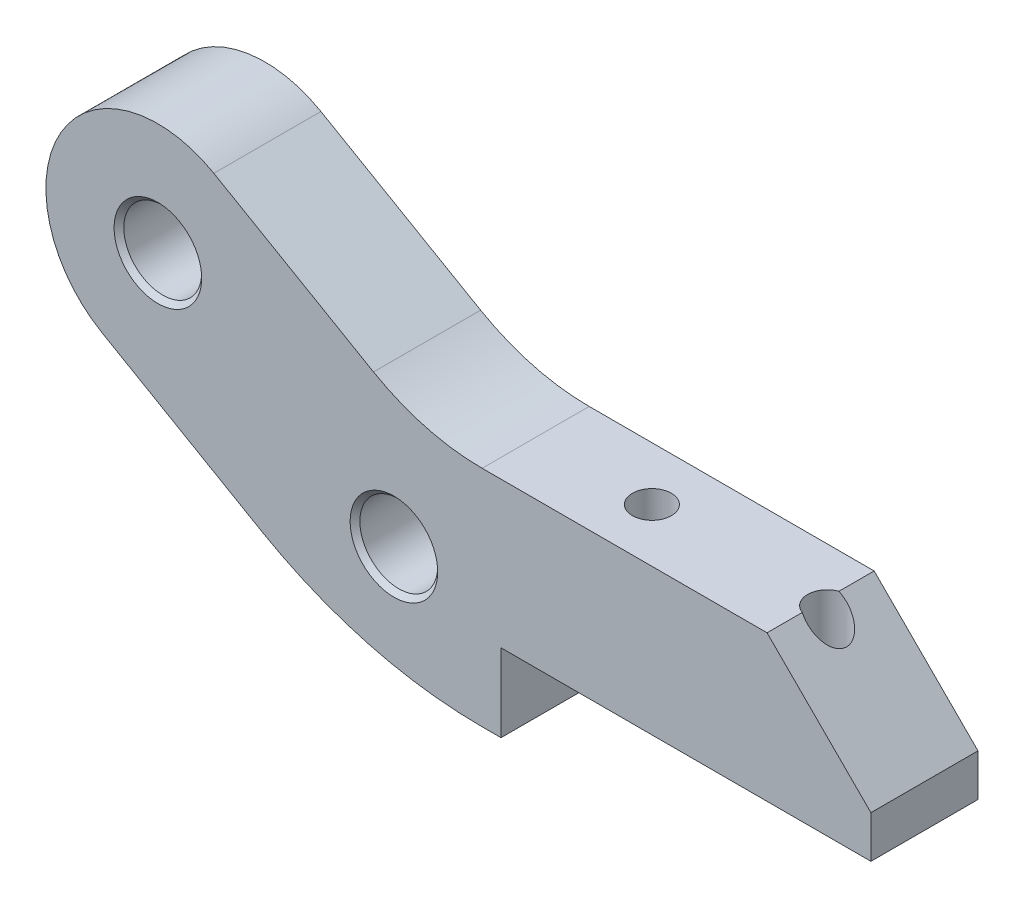
ISO-10303-21;
HEADER;
FILE_DESCRIPTION(('STEP AP214'),'2;1');
FILE_NAME('part.step','',(''),(''),'','','');
FILE_SCHEMA(('AUTOMOTIVE_DESIGN { 1 0 10303 214 1 1 1 1 }'));
ENDSEC;
DATA;
#1=APPLICATION_CONTEXT('core data for automotive mechanical design processes');
#2=APPLICATION_PROTOCOL_DEFINITION('international standard','automotive_design',2000,#1);
#3=PRODUCT_CONTEXT('',#1,'mechanical');
#4=PRODUCT('Part','Part','',(#3));
#5=PRODUCT_RELATED_PRODUCT_CATEGORY('part','',(#4));
#6=PRODUCT_DEFINITION_FORMATION('','',#4);
#7=PRODUCT_DEFINITION_CONTEXT('part definition',#1,'design');
#8=PRODUCT_DEFINITION('design','',#6,#7);
#9=PRODUCT_DEFINITION_SHAPE('','',#8);
#10=(LENGTH_UNIT() NAMED_UNIT(*) SI_UNIT(.MILLI.,.METRE.));
#11=(NAMED_UNIT(*) PLANE_ANGLE_UNIT() SI_UNIT($,.RADIAN.));
#12=(NAMED_UNIT(*) SI_UNIT($,.STERADIAN.) SOLID_ANGLE_UNIT());
#13=UNCERTAINTY_MEASURE_WITH_UNIT(LENGTH_MEASURE(1.E-05),#10,'distance_accuracy_value','');
#14=(GEOMETRIC_REPRESENTATION_CONTEXT(3) GLOBAL_UNCERTAINTY_ASSIGNED_CONTEXT((#13)) GLOBAL_UNIT_ASSIGNED_CONTEXT((#10,
#11,#12)) REPRESENTATION_CONTEXT('',''));
#15=CARTESIAN_POINT('',(0.,0.,0.));
#16=DIRECTION('',(0.,0.,1.));
#17=DIRECTION('',(1.,0.,0.));
#18=AXIS2_PLACEMENT_3D('',#15,#16,#17);
#19=CARTESIAN_POINT('',(23.0592502315386,53.8095821425827,11.));
#20=DIRECTION('',(0.,0.,-1.));
#21=DIRECTION('',(-1.,0.,0.));
#22=AXIS2_PLACEMENT_3D('',#19,#20,#21);
#23=CYLINDRICAL_SURFACE('',#22,22.3095821425826);
#24=CARTESIAN_POINT('',(23.0592502315386,53.8095821425827,0.));
#25=DIRECTION('',(0.,0.,-1.));
#26=DIRECTION('',(-1.,0.,0.));
#27=AXIS2_PLACEMENT_3D('',#24,#25,#26);
#28=CIRCLE('',#27,22.3095821425826);
#29=CARTESIAN_POINT('',(23.0592502315384,31.5000000000002,0.));
#30=VERTEX_POINT('',#29);
#31=CARTESIAN_POINT('',(11.9044591602472,34.4889172592905,0.));
#32=VERTEX_POINT('',#31);
#33=EDGE_CURVE('E189',#30,#32,#28,.T.);
#34=ORIENTED_EDGE('',*,*,#33,.T.);
#35=DIRECTION('',(0.,0.,-1.));
#36=VECTOR('',#35,1.);
#37=CARTESIAN_POINT('',(11.9044591602472,34.4889172592905,11.));
#38=LINE('',#37,#36);
#39=CARTESIAN_POINT('',(11.9044591602472,34.4889172592905,11.));
#40=VERTEX_POINT('',#39);
#41=EDGE_CURVE('E162',#40,#32,#38,.T.);
#42=ORIENTED_EDGE('',*,*,#41,.F.);
#43=CARTESIAN_POINT('',(23.0592502315386,53.8095821425827,11.));
#44=DIRECTION('',(0.,0.,-1.));
#45=DIRECTION('',(-1.,0.,0.));
#46=AXIS2_PLACEMENT_3D('',#43,#44,#45);
#47=CIRCLE('',#46,22.3095821425826);
#48=CARTESIAN_POINT('',(23.0592502315384,31.5000000000002,11.));
#49=VERTEX_POINT('',#48);
#50=EDGE_CURVE('E221',#49,#40,#47,.T.);
#51=ORIENTED_EDGE('',*,*,#50,.F.);
#52=DIRECTION('',(0.,0.,-1.));
#53=VECTOR('',#52,1.);
#54=CARTESIAN_POINT('',(23.0592502315384,31.5000000000002,11.));
#55=LINE('',#54,#53);
#56=EDGE_CURVE('E52',#49,#30,#55,.T.);
#57=ORIENTED_EDGE('',*,*,#56,.T.);
#58=EDGE_LOOP('',(#34,#42,#51,#57));
#59=FACE_BOUND('',#58,.T.);
#60=ADVANCED_FACE('F32',(#59),#23,.F.);
#61=CARTESIAN_POINT('',(11.9044591602472,34.4889172592905,11.));
#62=DIRECTION('',(-0.499999999999995,-0.866025403784442,0.));
#63=DIRECTION('',(0.866025403784442,-0.499999999999995,0.));
#64=AXIS2_PLACEMENT_3D('',#61,#62,#63);
#65=PLANE('',#64);
#66=DIRECTION('',(-0.866025403784442,0.499999999999995,0.));
#67=VECTOR('',#66,1.);
#68=CARTESIAN_POINT('',(11.9044591602472,34.4889172592905,0.));
#69=LINE('',#68,#67);
#70=CARTESIAN_POINT('',(-4.49871130596442,43.9592921435209,0.));
#71=VERTEX_POINT('',#70);
#72=EDGE_CURVE('E193',#32,#71,#69,.T.);
#73=ORIENTED_EDGE('',*,*,#72,.T.);
#74=DIRECTION('',(0.,0.,-1.));
#75=VECTOR('',#74,1.);
#76=CARTESIAN_POINT('',(-4.49871130596442,43.9592921435209,11.));
#77=LINE('',#76,#75);
#78=CARTESIAN_POINT('',(-4.49871130596442,43.9592921435209,11.));
#79=VERTEX_POINT('',#78);
#80=EDGE_CURVE('E159',#79,#71,#77,.T.);
#81=ORIENTED_EDGE('',*,*,#80,.F.);
#82=DIRECTION('',(-0.866025403784442,0.499999999999995,0.));
#83=VECTOR('',#82,1.);
#84=CARTESIAN_POINT('',(11.9044591602472,34.4889172592905,11.));
#85=LINE('',#84,#83);
#86=EDGE_CURVE('E224',#40,#79,#85,.T.);
#87=ORIENTED_EDGE('',*,*,#86,.F.);
#88=ORIENTED_EDGE('',*,*,#41,.T.);
#89=EDGE_LOOP('',(#73,#81,#87,#88));
#90=FACE_BOUND('',#89,.T.);
#91=ADVANCED_FACE('F284',(#90),#65,.F.);
#92=CARTESIAN_POINT('',(-10.2487113059646,34.,11.));
#93=DIRECTION('',(0.,0.,-1.));
#94=DIRECTION('',(-1.,0.,0.));
#95=AXIS2_PLACEMENT_3D('',#92,#93,#94);
#96=CYLINDRICAL_SURFACE('',#95,11.5);
#97=CARTESIAN_POINT('',(-10.2487113059646,34.,0.));
#98=DIRECTION('',(0.,0.,1.));
#99=DIRECTION('',(1.,0.,0.));
#100=AXIS2_PLACEMENT_3D('',#97,#98,#99);
#101=CIRCLE('',#100,11.5);
#102=CARTESIAN_POINT('',(-15.9987113059643,24.0407078564788,0.));
#103=VERTEX_POINT('',#102);
#104=EDGE_CURVE('E202',#71,#103,#101,.T.);
#105=ORIENTED_EDGE('',*,*,#104,.T.);
#106=DIRECTION('',(0.,0.,-1.));
#107=VECTOR('',#106,1.);
#108=CARTESIAN_POINT('',(-15.9987113059643,24.0407078564788,11.));
#109=LINE('',#108,#107);
#110=CARTESIAN_POINT('',(-15.9987113059643,24.0407078564788,11.));
#111=VERTEX_POINT('',#110);
#112=EDGE_CURVE('E156',#111,#103,#109,.T.);
#113=ORIENTED_EDGE('',*,*,#112,.F.);
#114=CARTESIAN_POINT('',(-10.2487113059646,34.,11.));
#115=DIRECTION('',(0.,0.,1.));
#116=DIRECTION('',(1.,0.,0.));
#117=AXIS2_PLACEMENT_3D('',#114,#115,#116);
#118=CIRCLE('',#117,11.5);
#119=EDGE_CURVE('E226',#79,#111,#118,.T.);
#120=ORIENTED_EDGE('',*,*,#119,.F.);
#121=ORIENTED_EDGE('',*,*,#80,.T.);
#122=EDGE_LOOP('',(#105,#113,#120,#121));
#123=FACE_BOUND('',#122,.T.);
#124=ADVANCED_FACE('F280',(#123),#96,.T.);
#125=CARTESIAN_POINT('',(-15.9987113059643,24.0407078564788,11.));
#126=DIRECTION('',(0.499999999999995,0.866025403784442,0.));
#127=DIRECTION('',(-0.866025403784442,0.499999999999995,0.));
#128=AXIS2_PLACEMENT_3D('',#125,#126,#127);
#129=PLANE('',#128);
#130=DIRECTION('',(0.866025403784442,-0.499999999999995,0.));
#131=VECTOR('',#130,1.);
#132=CARTESIAN_POINT('',(-15.9987113059643,24.0407078564788,0.));
#133=LINE('',#132,#131);
#134=CARTESIAN_POINT('',(0.404459160247318,14.5703329722484,0.));
#135=VERTEX_POINT('',#134);
#136=EDGE_CURVE('E204',#103,#135,#133,.T.);
#137=ORIENTED_EDGE('',*,*,#136,.T.);
#138=DIRECTION('',(0.,0.,-1.));
#139=VECTOR('',#138,1.);
#140=CARTESIAN_POINT('',(0.404459160247318,14.5703329722484,11.));
#141=LINE('',#140,#139);
#142=CARTESIAN_POINT('',(0.404459160247318,14.5703329722484,11.));
#143=VERTEX_POINT('',#142);
#144=EDGE_CURVE('E153',#143,#135,#141,.T.);
#145=ORIENTED_EDGE('',*,*,#144,.F.);
#146=DIRECTION('',(0.866025403784442,-0.499999999999995,0.));
#147=VECTOR('',#146,1.);
#148=CARTESIAN_POINT('',(-15.9987113059643,24.0407078564788,11.));
#149=LINE('',#148,#147);
#150=EDGE_CURVE('E228',#111,#143,#149,.T.);
#151=ORIENTED_EDGE('',*,*,#150,.F.);
#152=ORIENTED_EDGE('',*,*,#112,.T.);
#153=EDGE_LOOP('',(#137,#145,#151,#152));
#154=FACE_BOUND('',#153,.T.);
#155=ADVANCED_FACE('F277',(#154),#129,.F.);
#156=CARTESIAN_POINT('',(23.0592502315386,53.8095821425827,11.));
#157=DIRECTION('',(0.,0.,-1.));
#158=DIRECTION('',(-1.,0.,0.));
#159=AXIS2_PLACEMENT_3D('',#156,#157,#158);
#160=CYLINDRICAL_SURFACE('',#159,45.3095821425826);
#161=CARTESIAN_POINT('',(23.0592502315386,53.8095821425827,0.));
#162=DIRECTION('',(0.,0.,1.));
#163=DIRECTION('',(1.,0.,0.));
#164=AXIS2_PLACEMENT_3D('',#161,#162,#163);
#165=CIRCLE('',#164,45.3095821425826);
#166=CARTESIAN_POINT('',(23.0592502315384,8.50000000000015,0.));
#167=VERTEX_POINT('',#166);
#168=EDGE_CURVE('E206',#135,#167,#165,.T.);
#169=ORIENTED_EDGE('',*,*,#168,.T.);
#170=DIRECTION('',(0.,0.,-1.));
#171=VECTOR('',#170,1.);
#172=CARTESIAN_POINT('',(23.0592502315384,8.50000000000015,11.));
#173=LINE('',#172,#171);
#174=CARTESIAN_POINT('',(23.0592502315384,8.50000000000015,11.));
#175=VERTEX_POINT('',#174);
#176=EDGE_CURVE('E150',#175,#167,#173,.T.);
#177=ORIENTED_EDGE('',*,*,#176,.F.);
#178=CARTESIAN_POINT('',(23.0592502315386,53.8095821425827,11.));
#179=DIRECTION('',(0.,0.,1.));
#180=DIRECTION('',(1.,0.,0.));
#181=AXIS2_PLACEMENT_3D('',#178,#179,#180);
#182=CIRCLE('',#181,45.3095821425826);
#183=EDGE_CURVE('E230',#143,#175,#182,.T.);
#184=ORIENTED_EDGE('',*,*,#183,.F.);
#185=ORIENTED_EDGE('',*,*,#144,.T.);
#186=EDGE_LOOP('',(#169,#177,#184,#185));
#187=FACE_BOUND('',#186,.T.);
#188=ADVANCED_FACE('F273',(#187),#160,.T.);
#189=CARTESIAN_POINT('',(23.0592502315384,8.50000000000015,11.));
#190=DIRECTION('',(0.,1.,0.));
#191=DIRECTION('',(-1.,0.,0.));
#192=AXIS2_PLACEMENT_3D('',#189,#190,#191);
#193=PLANE('',#192);
#194=DIRECTION('',(1.,0.,0.));
#195=VECTOR('',#194,1.);
#196=CARTESIAN_POINT('',(23.0592502315384,8.50000000000015,0.));
#197=LINE('',#196,#195);
#198=CARTESIAN_POINT('',(25.,8.5,0.));
#199=VERTEX_POINT('',#198);
#200=EDGE_CURVE('E208',#167,#199,#197,.T.);
#201=ORIENTED_EDGE('',*,*,#200,.T.);
#202=DIRECTION('',(0.,0.,-1.));
#203=VECTOR('',#202,1.);
#204=CARTESIAN_POINT('',(25.,8.5,11.));
#205=LINE('',#204,#203);
#206=CARTESIAN_POINT('',(25.,8.5,11.));
#207=VERTEX_POINT('',#206);
#208=EDGE_CURVE('E147',#207,#199,#205,.T.);
#209=ORIENTED_EDGE('',*,*,#208,.F.);
#210=DIRECTION('',(1.,0.,0.));
#211=VECTOR('',#210,1.);
#212=CARTESIAN_POINT('',(23.0592502315384,8.50000000000015,11.));
#213=LINE('',#212,#211);
#214=EDGE_CURVE('E232',#175,#207,#213,.T.);
#215=ORIENTED_EDGE('',*,*,#214,.F.);
#216=ORIENTED_EDGE('',*,*,#176,.T.);
#217=EDGE_LOOP('',(#201,#209,#215,#216));
#218=FACE_BOUND('',#217,.T.);
#219=ADVANCED_FACE('F268',(#218),#193,.F.);
#220=CARTESIAN_POINT('',(25.,8.5,11.));
#221=DIRECTION('',(-1.,0.,0.));
#222=DIRECTION('',(0.,0.,1.));
#223=AXIS2_PLACEMENT_3D('',#220,#221,#222);
#224=PLANE('',#223);
#225=DIRECTION('',(0.,1.,0.));
#226=VECTOR('',#225,1.);
#227=CARTESIAN_POINT('',(25.,8.5,0.));
#228=LINE('',#227,#226);
#229=CARTESIAN_POINT('',(25.,16.5,0.));
#230=VERTEX_POINT('',#229);
#231=EDGE_CURVE('E210',#199,#230,#228,.T.);
#232=ORIENTED_EDGE('',*,*,#231,.T.);
#233=DIRECTION('',(0.,0.,-1.));
#234=VECTOR('',#233,1.);
#235=CARTESIAN_POINT('',(25.,16.5,11.));
#236=LINE('',#235,#234);
#237=CARTESIAN_POINT('',(25.,16.5,11.));
#238=VERTEX_POINT('',#237);
#239=EDGE_CURVE('E144',#238,#230,#236,.T.);
#240=ORIENTED_EDGE('',*,*,#239,.F.);
#241=DIRECTION('',(0.,1.,0.));
#242=VECTOR('',#241,1.);
#243=CARTESIAN_POINT('',(25.,8.5,11.));
#244=LINE('',#243,#242);
#245=EDGE_CURVE('E234',#207,#238,#244,.T.);
#246=ORIENTED_EDGE('',*,*,#245,.F.);
#247=ORIENTED_EDGE('',*,*,#208,.T.);
#248=EDGE_LOOP('',(#232,#240,#246,#247));
#249=FACE_BOUND('',#248,.T.);
#250=ADVANCED_FACE('F262',(#249),#224,.F.);
#251=CARTESIAN_POINT('',(25.,16.5,11.));
#252=DIRECTION('',(0.,1.,0.));
#253=DIRECTION('',(-1.,0.,0.));
#254=AXIS2_PLACEMENT_3D('',#251,#252,#253);
#255=PLANE('',#254);
#256=CARTESIAN_POINT('',(52.9999999999999,16.4999999999999,5.5));
#257=DIRECTION('',(0.,-1.,0.));
#258=DIRECTION('',(0.,0.,-1.));
#259=AXIS2_PLACEMENT_3D('',#256,#257,#258);
#260=CIRCLE('',#259,2.);
#261=CARTESIAN_POINT('',(52.9999999999999,16.4999999999999,3.5));
#262=VERTEX_POINT('',#261);
#263=EDGE_CURVE('E128',#262,#262,#260,.T.);
#264=ORIENTED_EDGE('',*,*,#263,.F.);
#265=EDGE_LOOP('',(#264));
#266=FACE_BOUND('',#265,.T.);
#267=CARTESIAN_POINT('',(34.9999999999999,16.4999999999999,5.5));
#268=DIRECTION('',(0.,-1.,0.));
#269=DIRECTION('',(0.,0.,-1.));
#270=AXIS2_PLACEMENT_3D('',#267,#268,#269);
#271=CIRCLE('',#270,2.);
#272=CARTESIAN_POINT('',(34.9999999999999,16.4999999999999,3.5));
#273=VERTEX_POINT('',#272);
#274=EDGE_CURVE('E127',#273,#273,#271,.T.);
#275=ORIENTED_EDGE('',*,*,#274,.F.);
#276=EDGE_LOOP('',(#275));
#277=FACE_BOUND('',#276,.T.);
#278=DIRECTION('',(1.,0.,0.));
#279=VECTOR('',#278,1.);
#280=CARTESIAN_POINT('',(25.,16.5,0.));
#281=LINE('',#280,#279);
#282=CARTESIAN_POINT('',(62.9999999999998,16.5000000000002,0.));
#283=VERTEX_POINT('',#282);
#284=EDGE_CURVE('E212',#230,#283,#281,.T.);
#285=ORIENTED_EDGE('',*,*,#284,.T.);
#286=DIRECTION('',(0.,0.,-1.));
#287=VECTOR('',#286,1.);
#288=CARTESIAN_POINT('',(62.9999999999998,16.5000000000002,11.));
#289=LINE('',#288,#287);
#290=CARTESIAN_POINT('',(62.9999999999998,16.5000000000002,11.));
#291=VERTEX_POINT('',#290);
#292=EDGE_CURVE('E137',#291,#283,#289,.T.);
#293=ORIENTED_EDGE('',*,*,#292,.F.);
#294=DIRECTION('',(1.,0.,0.));
#295=VECTOR('',#294,1.);
#296=CARTESIAN_POINT('',(25.,16.5,11.));
#297=LINE('',#296,#295);
#298=EDGE_CURVE('E236',#238,#291,#297,.T.);
#299=ORIENTED_EDGE('',*,*,#298,.F.);
#300=ORIENTED_EDGE('',*,*,#239,.T.);
#301=EDGE_LOOP('',(#285,#293,#299,#300));
#302=FACE_BOUND('',#301,.T.);
#303=ADVANCED_FACE('F258',(#266,#277,#302),#255,.F.);
#304=CARTESIAN_POINT('',(62.9999999999998,16.5000000000002,11.));
#305=DIRECTION('',(-1.,0.,0.));
#306=DIRECTION('',(0.,0.,1.));
#307=AXIS2_PLACEMENT_3D('',#304,#305,#306);
#308=PLANE('',#307);
#309=DIRECTION('',(0.,1.,0.));
#310=VECTOR('',#309,1.);
#311=CARTESIAN_POINT('',(62.9999999999998,16.5000000000002,0.));
#312=LINE('',#311,#310);
#313=CARTESIAN_POINT('',(62.9999999999998,20.8311911612961,0.));
#314=VERTEX_POINT('',#313);
#315=EDGE_CURVE('E214',#283,#314,#312,.T.);
#316=ORIENTED_EDGE('',*,*,#315,.T.);
#317=DIRECTION('',(0.,0.,-1.));
#318=VECTOR('',#317,1.);
#319=CARTESIAN_POINT('',(62.9999999999998,20.8311911612961,11.));
#320=LINE('',#319,#318);
#321=CARTESIAN_POINT('',(62.9999999999998,20.8311911612961,11.));
#322=VERTEX_POINT('',#321);
#323=EDGE_CURVE('E134',#322,#314,#320,.T.);
#324=ORIENTED_EDGE('',*,*,#323,.F.);
#325=DIRECTION('',(0.,1.,0.));
#326=VECTOR('',#325,1.);
#327=CARTESIAN_POINT('',(62.9999999999998,16.5000000000002,11.));
#328=LINE('',#327,#326);
#329=EDGE_CURVE('E238',#291,#322,#328,.T.);
#330=ORIENTED_EDGE('',*,*,#329,.F.);
#331=ORIENTED_EDGE('',*,*,#292,.T.);
#332=EDGE_LOOP('',(#316,#324,#330,#331));
#333=FACE_BOUND('',#332,.T.);
#334=ADVANCED_FACE('F253',(#333),#308,.F.);
#335=CARTESIAN_POINT('',(62.9999999999998,20.8311911612961,11.));
#336=DIRECTION('',(-0.707106781186539,-0.707106781186556,0.));
#337=DIRECTION('',(0.707106781186556,-0.707106781186539,0.));
#338=AXIS2_PLACEMENT_3D('',#335,#336,#337);
#339=PLANE('',#338);
#340=DIRECTION('',(0.,0.,-1.));
#341=VECTOR('',#340,1.);
#342=CARTESIAN_POINT('',(52.3311911612956,31.5,11.));
#343=LINE('',#342,#341);
#344=CARTESIAN_POINT('',(52.3311911612956,31.5,3.61514065849174));
#345=VERTEX_POINT('',#344);
#346=CARTESIAN_POINT('',(52.3311911612956,31.5,0.));
#347=VERTEX_POINT('',#346);
#348=EDGE_CURVE('E126',#345,#347,#343,.T.);
#349=ORIENTED_EDGE('',*,*,#348,.F.);
#350=CARTESIAN_POINT('',(52.9999999999999,30.8311911612957,5.5));
#351=DIRECTION('',(-0.707106781186539,-0.707106781186556,0.));
#352=DIRECTION('',(0.707106781186556,-0.707106781186539,0.));
#353=AXIS2_PLACEMENT_3D('',#350,#351,#352);
#354=ELLIPSE('',#353,2.82842712474616,2.);
#355=CARTESIAN_POINT('',(52.3311911612956,31.5,7.38485934150826));
#356=VERTEX_POINT('',#355);
#357=EDGE_CURVE('E44',#345,#356,#354,.T.);
#358=ORIENTED_EDGE('',*,*,#357,.T.);
#359=CARTESIAN_POINT('',(52.3311911612956,31.5,11.));
#360=VERTEX_POINT('',#359);
#361=EDGE_CURVE('E124',#360,#356,#343,.T.);
#362=ORIENTED_EDGE('',*,*,#361,.F.);
#363=DIRECTION('',(-0.707106781186556,0.707106781186539,0.));
#364=VECTOR('',#363,1.);
#365=CARTESIAN_POINT('',(62.9999999999998,20.8311911612961,11.));
#366=LINE('',#365,#364);
#367=EDGE_CURVE('E240',#322,#360,#366,.T.);
#368=ORIENTED_EDGE('',*,*,#367,.F.);
#369=ORIENTED_EDGE('',*,*,#323,.T.);
#370=DIRECTION('',(-0.707106781186556,0.707106781186539,0.));
#371=VECTOR('',#370,1.);
#372=CARTESIAN_POINT('',(62.9999999999998,20.8311911612961,0.));
#373=LINE('',#372,#371);
#374=EDGE_CURVE('E216',#314,#347,#373,.T.);
#375=ORIENTED_EDGE('',*,*,#374,.T.);
#376=EDGE_LOOP('',(#349,#358,#362,#368,#369,#375));
#377=FACE_BOUND('',#376,.T.);
#378=ADVANCED_FACE('F122',(#377),#339,.F.);
#379=CARTESIAN_POINT('',(23.0592502315384,31.5000000000002,11.));
#380=DIRECTION('',(0.,1.,0.));
#381=DIRECTION('',(-1.,0.,0.));
#382=AXIS2_PLACEMENT_3D('',#379,#380,#381);
#383=PLANE('',#382);
#384=CARTESIAN_POINT('',(52.9999999999999,31.5,5.5));
#385=DIRECTION('',(0.,1.,0.));
#386=DIRECTION('',(-1.,0.,0.));
#387=AXIS2_PLACEMENT_3D('',#384,#385,#386);
#388=CIRCLE('',#387,2.);
#389=EDGE_CURVE('E11',#345,#356,#388,.T.);
#390=ORIENTED_EDGE('',*,*,#389,.F.);
#391=ORIENTED_EDGE('',*,*,#348,.T.);
#392=DIRECTION('',(1.,0.,0.));
#393=VECTOR('',#392,1.);
#394=CARTESIAN_POINT('',(23.0592502315384,31.5000000000002,0.));
#395=LINE('',#394,#393);
#396=EDGE_CURVE('E218',#30,#347,#395,.T.);
#397=ORIENTED_EDGE('',*,*,#396,.F.);
#398=ORIENTED_EDGE('',*,*,#56,.F.);
#399=DIRECTION('',(1.,0.,0.));
#400=VECTOR('',#399,1.);
#401=CARTESIAN_POINT('',(23.0592502315384,31.5000000000002,11.));
#402=LINE('',#401,#400);
#403=EDGE_CURVE('E133',#49,#360,#402,.T.);
#404=ORIENTED_EDGE('',*,*,#403,.T.);
#405=ORIENTED_EDGE('',*,*,#361,.T.);
#406=EDGE_LOOP('',(#390,#391,#397,#398,#404,#405));
#407=FACE_BOUND('',#406,.T.);
#408=CARTESIAN_POINT('',(34.9999999999999,31.5000000000001,5.5));
#409=DIRECTION('',(0.,1.,0.));
#410=DIRECTION('',(-1.,0.,0.));
#411=AXIS2_PLACEMENT_3D('',#408,#409,#410);
#412=CIRCLE('',#411,2.);
#413=CARTESIAN_POINT('',(32.9999999999999,31.5000000000001,5.5));
#414=VERTEX_POINT('',#413);
#415=EDGE_CURVE('E187',#414,#414,#412,.T.);
#416=ORIENTED_EDGE('',*,*,#415,.F.);
#417=EDGE_LOOP('',(#416));
#418=FACE_BOUND('',#417,.T.);
#419=ADVANCED_FACE('F130',(#407,#418),#383,.T.);
#420=CARTESIAN_POINT('',(23.0592502315386,53.8095821425827,11.));
#421=DIRECTION('',(0.,0.,-1.));
#422=DIRECTION('',(-1.,0.,0.));
#423=AXIS2_PLACEMENT_3D('',#420,#421,#422);
#424=PLANE('',#423);
#425=CARTESIAN_POINT('',(14.,20.,11.));
#426=DIRECTION('',(0.,0.,-1.));
#427=DIRECTION('',(-1.,0.,0.));
#428=AXIS2_PLACEMENT_3D('',#425,#426,#427);
#429=CIRCLE('',#428,4.50000000000001);
#430=CARTESIAN_POINT('',(9.49999999999999,20.,11.));
#431=VERTEX_POINT('',#430);
#432=EDGE_CURVE('E183',#431,#431,#429,.T.);
#433=ORIENTED_EDGE('',*,*,#432,.T.);
#434=EDGE_LOOP('',(#433));
#435=FACE_BOUND('',#434,.T.);
#436=CARTESIAN_POINT('',(-10.2487113059644,33.9999999999999,11.));
#437=DIRECTION('',(0.,0.,-1.));
#438=DIRECTION('',(-1.,0.,0.));
#439=AXIS2_PLACEMENT_3D('',#436,#437,#438);
#440=CIRCLE('',#439,4.50000000000001);
#441=CARTESIAN_POINT('',(-14.7487113059644,33.9999999999999,11.));
#442=VERTEX_POINT('',#441);
#443=EDGE_CURVE('E171',#442,#442,#440,.T.);
#444=ORIENTED_EDGE('',*,*,#443,.T.);
#445=EDGE_LOOP('',(#444));
#446=FACE_BOUND('',#445,.T.);
#447=ORIENTED_EDGE('',*,*,#50,.T.);
#448=ORIENTED_EDGE('',*,*,#86,.T.);
#449=ORIENTED_EDGE('',*,*,#119,.T.);
#450=ORIENTED_EDGE('',*,*,#150,.T.);
#451=ORIENTED_EDGE('',*,*,#183,.T.);
#452=ORIENTED_EDGE('',*,*,#214,.T.);
#453=ORIENTED_EDGE('',*,*,#245,.T.);
#454=ORIENTED_EDGE('',*,*,#298,.T.);
#455=ORIENTED_EDGE('',*,*,#329,.T.);
#456=ORIENTED_EDGE('',*,*,#367,.T.);
#457=ORIENTED_EDGE('',*,*,#403,.F.);
#458=EDGE_LOOP('',(#447,#448,#449,#450,#451,#452,#453,#454,#455,#456,#457));
#459=FACE_BOUND('',#458,.T.);
#460=ADVANCED_FACE('F286',(#435,#446,#459),#424,.F.);
#461=CARTESIAN_POINT('',(23.0592502315386,53.8095821425827,0.));
#462=DIRECTION('',(0.,0.,-1.));
#463=DIRECTION('',(-1.,0.,0.));
#464=AXIS2_PLACEMENT_3D('',#461,#462,#463);
#465=PLANE('',#464);
#466=CARTESIAN_POINT('',(14.,20.,0.));
#467=DIRECTION('',(0.,0.,-1.));
#468=DIRECTION('',(-1.,0.,0.));
#469=AXIS2_PLACEMENT_3D('',#466,#467,#468);
#470=CIRCLE('',#469,4.50000000000001);
#471=CARTESIAN_POINT('',(9.49999999999998,20.,0.));
#472=VERTEX_POINT('',#471);
#473=EDGE_CURVE('E39',#472,#472,#470,.F.);
#474=ORIENTED_EDGE('',*,*,#473,.T.);
#475=EDGE_LOOP('',(#474));
#476=FACE_BOUND('',#475,.T.);
#477=CARTESIAN_POINT('',(-10.2487113059644,33.9999999999999,0.));
#478=DIRECTION('',(0.,0.,-1.));
#479=DIRECTION('',(-1.,0.,0.));
#480=AXIS2_PLACEMENT_3D('',#477,#478,#479);
#481=CIRCLE('',#480,4.50000000000001);
#482=CARTESIAN_POINT('',(-14.7487113059644,33.9999999999999,0.));
#483=VERTEX_POINT('',#482);
#484=EDGE_CURVE('E174',#483,#483,#481,.F.);
#485=ORIENTED_EDGE('',*,*,#484,.T.);
#486=EDGE_LOOP('',(#485));
#487=FACE_BOUND('',#486,.T.);
#488=ORIENTED_EDGE('',*,*,#33,.F.);
#489=ORIENTED_EDGE('',*,*,#396,.T.);
#490=ORIENTED_EDGE('',*,*,#374,.F.);
#491=ORIENTED_EDGE('',*,*,#315,.F.);
#492=ORIENTED_EDGE('',*,*,#284,.F.);
#493=ORIENTED_EDGE('',*,*,#231,.F.);
#494=ORIENTED_EDGE('',*,*,#200,.F.);
#495=ORIENTED_EDGE('',*,*,#168,.F.);
#496=ORIENTED_EDGE('',*,*,#136,.F.);
#497=ORIENTED_EDGE('',*,*,#104,.F.);
#498=ORIENTED_EDGE('',*,*,#72,.F.);
#499=EDGE_LOOP('',(#488,#489,#490,#491,#492,#493,#494,#495,#496,#497,#498));
#500=FACE_BOUND('',#499,.T.);
#501=ADVANCED_FACE('F245',(#476,#487,#500),#465,.T.);
#502=CARTESIAN_POINT('',(-10.2487113059644,33.9999999999999,0.));
#503=DIRECTION('',(0.,0.,1.));
#504=DIRECTION('',(1.,0.,0.));
#505=AXIS2_PLACEMENT_3D('',#502,#503,#504);
#506=CYLINDRICAL_SURFACE('',#505,4.);
#507=CARTESIAN_POINT('',(-10.2487113059644,33.9999999999999,10.5));
#508=DIRECTION('',(0.,0.,-1.));
#509=DIRECTION('',(-1.,0.,0.));
#510=AXIS2_PLACEMENT_3D('',#507,#508,#509);
#511=CIRCLE('',#510,4.);
#512=CARTESIAN_POINT('',(-14.2487113059644,33.9999999999999,10.5));
#513=VERTEX_POINT('',#512);
#514=EDGE_CURVE('E168',#513,#513,#511,.F.);
#515=ORIENTED_EDGE('',*,*,#514,.T.);
#516=EDGE_LOOP('',(#515));
#517=FACE_BOUND('',#516,.T.);
#518=CARTESIAN_POINT('',(-10.2487113059644,33.9999999999999,0.500000000000004));
#519=DIRECTION('',(0.,0.,-1.));
#520=DIRECTION('',(-1.,0.,0.));
#521=AXIS2_PLACEMENT_3D('',#518,#519,#520);
#522=CIRCLE('',#521,4.);
#523=CARTESIAN_POINT('',(-14.2487113059644,33.9999999999999,0.500000000000004));
#524=VERTEX_POINT('',#523);
#525=EDGE_CURVE('E165',#524,#524,#522,.T.);
#526=ORIENTED_EDGE('',*,*,#525,.T.);
#527=EDGE_LOOP('',(#526));
#528=FACE_BOUND('',#527,.T.);
#529=ADVANCED_FACE('F294',(#517,#528),#506,.F.);
#530=CARTESIAN_POINT('',(-10.2487113059644,33.9999999999999,10.5));
#531=DIRECTION('',(0.,0.,1.));
#532=DIRECTION('',(1.,0.,0.));
#533=AXIS2_PLACEMENT_3D('',#530,#531,#532);
#534=CONICAL_SURFACE('',#533,4.,0.785398163397454);
#535=ORIENTED_EDGE('',*,*,#443,.F.);
#536=EDGE_LOOP('',(#535));
#537=FACE_BOUND('',#536,.T.);
#538=ORIENTED_EDGE('',*,*,#514,.F.);
#539=EDGE_LOOP('',(#538));
#540=FACE_BOUND('',#539,.T.);
#541=ADVANCED_FACE('F372',(#537,#540),#534,.F.);
#542=CARTESIAN_POINT('',(-10.2487113059644,33.9999999999999,0.));
#543=DIRECTION('',(0.,0.,-1.));
#544=DIRECTION('',(-1.,0.,0.));
#545=AXIS2_PLACEMENT_3D('',#542,#543,#544);
#546=CONICAL_SURFACE('',#545,4.50000000000001,0.785398163397455);
#547=ORIENTED_EDGE('',*,*,#525,.F.);
#548=EDGE_LOOP('',(#547));
#549=FACE_BOUND('',#548,.T.);
#550=ORIENTED_EDGE('',*,*,#484,.F.);
#551=EDGE_LOOP('',(#550));
#552=FACE_BOUND('',#551,.T.);
#553=ADVANCED_FACE('F368',(#549,#552),#546,.F.);
#554=CARTESIAN_POINT('',(14.,20.,0.));
#555=DIRECTION('',(0.,0.,1.));
#556=DIRECTION('',(1.,0.,0.));
#557=AXIS2_PLACEMENT_3D('',#554,#555,#556);
#558=CYLINDRICAL_SURFACE('',#557,4.);
#559=CARTESIAN_POINT('',(14.,20.,10.5));
#560=DIRECTION('',(0.,0.,-1.));
#561=DIRECTION('',(-1.,0.,0.));
#562=AXIS2_PLACEMENT_3D('',#559,#560,#561);
#563=CIRCLE('',#562,4.);
#564=CARTESIAN_POINT('',(9.99999999999999,20.,10.5));
#565=VERTEX_POINT('',#564);
#566=EDGE_CURVE('E180',#565,#565,#563,.F.);
#567=ORIENTED_EDGE('',*,*,#566,.T.);
#568=EDGE_LOOP('',(#567));
#569=FACE_BOUND('',#568,.T.);
#570=CARTESIAN_POINT('',(14.,20.,0.500000000000004));
#571=DIRECTION('',(0.,0.,-1.));
#572=DIRECTION('',(-1.,0.,0.));
#573=AXIS2_PLACEMENT_3D('',#570,#571,#572);
#574=CIRCLE('',#573,4.);
#575=CARTESIAN_POINT('',(9.99999999999999,20.,0.500000000000004));
#576=VERTEX_POINT('',#575);
#577=EDGE_CURVE('E177',#576,#576,#574,.T.);
#578=ORIENTED_EDGE('',*,*,#577,.T.);
#579=EDGE_LOOP('',(#578));
#580=FACE_BOUND('',#579,.T.);
#581=ADVANCED_FACE('F364',(#569,#580),#558,.F.);
#582=CARTESIAN_POINT('',(14.,20.,10.5));
#583=DIRECTION('',(0.,0.,1.));
#584=DIRECTION('',(1.,0.,0.));
#585=AXIS2_PLACEMENT_3D('',#582,#583,#584);
#586=CONICAL_SURFACE('',#585,4.,0.785398163397453);
#587=ORIENTED_EDGE('',*,*,#432,.F.);
#588=EDGE_LOOP('',(#587));
#589=FACE_BOUND('',#588,.T.);
#590=ORIENTED_EDGE('',*,*,#566,.F.);
#591=EDGE_LOOP('',(#590));
#592=FACE_BOUND('',#591,.T.);
#593=ADVANCED_FACE('F360',(#589,#592),#586,.F.);
#594=CARTESIAN_POINT('',(14.,20.,0.));
#595=DIRECTION('',(0.,0.,-1.));
#596=DIRECTION('',(-1.,0.,0.));
#597=AXIS2_PLACEMENT_3D('',#594,#595,#596);
#598=CONICAL_SURFACE('',#597,4.50000000000001,0.785398163397454);
#599=ORIENTED_EDGE('',*,*,#577,.F.);
#600=EDGE_LOOP('',(#599));
#601=FACE_BOUND('',#600,.T.);
#602=ORIENTED_EDGE('',*,*,#473,.F.);
#603=EDGE_LOOP('',(#602));
#604=FACE_BOUND('',#603,.T.);
#605=ADVANCED_FACE('F342',(#601,#604),#598,.F.);
#606=CARTESIAN_POINT('',(34.9999999999999,38.3492352772158,5.5));
#607=DIRECTION('',(0.,-1.,0.));
#608=DIRECTION('',(0.,0.,-1.));
#609=AXIS2_PLACEMENT_3D('',#606,#607,#608);
#610=CYLINDRICAL_SURFACE('',#609,2.);
#611=ORIENTED_EDGE('',*,*,#415,.T.);
#612=EDGE_LOOP('',(#611));
#613=FACE_BOUND('',#612,.T.);
#614=ORIENTED_EDGE('',*,*,#274,.T.);
#615=EDGE_LOOP('',(#614));
#616=FACE_BOUND('',#615,.T.);
#617=ADVANCED_FACE('F337',(#613,#616),#610,.F.);
#618=CARTESIAN_POINT('',(52.9999999999999,38.3492352772158,5.5));
#619=DIRECTION('',(0.,-1.,0.));
#620=DIRECTION('',(0.,0.,-1.));
#621=AXIS2_PLACEMENT_3D('',#618,#619,#620);
#622=CYLINDRICAL_SURFACE('',#621,2.);
#623=ORIENTED_EDGE('',*,*,#263,.T.);
#624=EDGE_LOOP('',(#623));
#625=FACE_BOUND('',#624,.T.);
#626=ORIENTED_EDGE('',*,*,#389,.T.);
#627=ORIENTED_EDGE('',*,*,#357,.F.);
#628=EDGE_LOOP('',(#626,#627));
#629=FACE_BOUND('',#628,.T.);
#630=ADVANCED_FACE('F117',(#625,#629),#622,.F.);
#631=CLOSED_SHELL('',(#60,#91,#124,#155,#188,#219,#250,#303,#334,#378,#419,#460,#501,#529,#541,
#553,#581,#593,#605,#617,#630));
#632=MANIFOLD_SOLID_BREP('B2',#631);
#633=ADVANCED_BREP_SHAPE_REPRESENTATION('',(#18,#632),#14);
#634=SHAPE_DEFINITION_REPRESENTATION(#9,#633);
ENDSEC;
END-ISO-10303-21;
